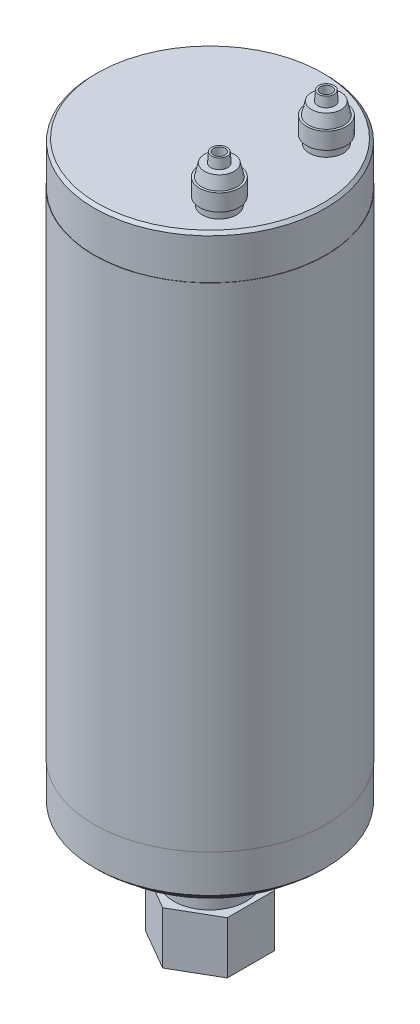
ISO-10303-21;
HEADER;
FILE_DESCRIPTION(('STEP AP214'),'2;1');
FILE_NAME('part.step','',(''),(''),'','','');
FILE_SCHEMA(('AUTOMOTIVE_DESIGN { 1 0 10303 214 1 1 1 1 }'));
ENDSEC;
DATA;
#1=APPLICATION_CONTEXT('core data for automotive mechanical design processes');
#2=APPLICATION_PROTOCOL_DEFINITION('international standard','automotive_design',2000,#1);
#3=PRODUCT_CONTEXT('',#1,'mechanical');
#4=PRODUCT('Part','Part','',(#3));
#5=PRODUCT_RELATED_PRODUCT_CATEGORY('part','',(#4));
#6=PRODUCT_DEFINITION_FORMATION('','',#4);
#7=PRODUCT_DEFINITION_CONTEXT('part definition',#1,'design');
#8=PRODUCT_DEFINITION('design','',#6,#7);
#9=PRODUCT_DEFINITION_SHAPE('','',#8);
#10=(LENGTH_UNIT() NAMED_UNIT(*) SI_UNIT(.MILLI.,.METRE.));
#11=(NAMED_UNIT(*) PLANE_ANGLE_UNIT() SI_UNIT($,.RADIAN.));
#12=(NAMED_UNIT(*) SI_UNIT($,.STERADIAN.) SOLID_ANGLE_UNIT());
#13=UNCERTAINTY_MEASURE_WITH_UNIT(LENGTH_MEASURE(1.E-05),#10,'distance_accuracy_value','');
#14=(GEOMETRIC_REPRESENTATION_CONTEXT(3) GLOBAL_UNCERTAINTY_ASSIGNED_CONTEXT((#13)) GLOBAL_UNIT_ASSIGNED_CONTEXT((#10,
#11,#12)) REPRESENTATION_CONTEXT('',''));
#15=CARTESIAN_POINT('',(0.,0.,0.));
#16=DIRECTION('',(0.,0.,1.));
#17=DIRECTION('',(1.,0.,0.));
#18=AXIS2_PLACEMENT_3D('',#15,#16,#17);
#19=CARTESIAN_POINT('',(0.,104.5,0.));
#20=DIRECTION('',(0.,1.,0.));
#21=DIRECTION('',(0.,0.,1.));
#22=AXIS2_PLACEMENT_3D('',#19,#20,#21);
#23=PLANE('',#22);
#24=CARTESIAN_POINT('',(21.67,104.5,18.45));
#25=DIRECTION('',(0.,1.,0.));
#26=DIRECTION('',(0.,0.,1.));
#27=AXIS2_PLACEMENT_3D('',#24,#25,#26);
#28=CIRCLE('',#27,5.85);
#29=CARTESIAN_POINT('',(21.67,104.5,24.3));
#30=VERTEX_POINT('',#29);
#31=EDGE_CURVE('E47',#30,#30,#28,.T.);
#32=ORIENTED_EDGE('',*,*,#31,.F.);
#33=EDGE_LOOP('',(#32));
#34=FACE_BOUND('',#33,.T.);
#35=CARTESIAN_POINT('',(21.67,104.5,-18.45));
#36=DIRECTION('',(0.,1.,0.));
#37=DIRECTION('',(0.,0.,1.));
#38=AXIS2_PLACEMENT_3D('',#35,#36,#37);
#39=CIRCLE('',#38,5.85);
#40=CARTESIAN_POINT('',(21.67,104.5,-12.6));
#41=VERTEX_POINT('',#40);
#42=EDGE_CURVE('E195',#41,#41,#39,.T.);
#43=ORIENTED_EDGE('',*,*,#42,.F.);
#44=EDGE_LOOP('',(#43));
#45=FACE_BOUND('',#44,.T.);
#46=CARTESIAN_POINT('',(0.,104.5,0.));
#47=DIRECTION('',(0.,1.,0.));
#48=DIRECTION('',(0.,0.,1.));
#49=AXIS2_PLACEMENT_3D('',#46,#47,#48);
#50=CIRCLE('',#49,38.9);
#51=CARTESIAN_POINT('',(0.,104.5,38.9));
#52=VERTEX_POINT('',#51);
#53=EDGE_CURVE('E171',#52,#52,#50,.T.);
#54=ORIENTED_EDGE('',*,*,#53,.T.);
#55=EDGE_LOOP('',(#54));
#56=FACE_BOUND('',#55,.T.);
#57=ADVANCED_FACE('F38',(#34,#45,#56),#23,.T.);
#58=CARTESIAN_POINT('',(0.,104.5,0.));
#59=DIRECTION('',(0.,1.,0.));
#60=DIRECTION('',(0.,0.,1.));
#61=AXIS2_PLACEMENT_3D('',#58,#59,#60);
#62=CYLINDRICAL_SURFACE('',#61,39.9);
#63=CARTESIAN_POINT('',(0.,103.5,0.));
#64=DIRECTION('',(0.,1.,0.));
#65=DIRECTION('',(0.,0.,1.));
#66=AXIS2_PLACEMENT_3D('',#63,#64,#65);
#67=CIRCLE('',#66,39.9);
#68=CARTESIAN_POINT('',(0.,103.5,39.9));
#69=VERTEX_POINT('',#68);
#70=EDGE_CURVE('E174',#69,#69,#67,.F.);
#71=ORIENTED_EDGE('',*,*,#70,.T.);
#72=EDGE_LOOP('',(#71));
#73=FACE_BOUND('',#72,.T.);
#74=CARTESIAN_POINT('',(0.,89.5,0.));
#75=DIRECTION('',(0.,1.,0.));
#76=DIRECTION('',(0.,0.,1.));
#77=AXIS2_PLACEMENT_3D('',#74,#75,#76);
#78=CIRCLE('',#77,39.9);
#79=CARTESIAN_POINT('',(0.,89.5,39.9));
#80=VERTEX_POINT('',#79);
#81=EDGE_CURVE('E168',#80,#80,#78,.T.);
#82=ORIENTED_EDGE('',*,*,#81,.T.);
#83=EDGE_LOOP('',(#82));
#84=FACE_BOUND('',#83,.T.);
#85=ADVANCED_FACE('F207',(#73,#84),#62,.T.);
#86=CARTESIAN_POINT('',(0.,89.5,39.9));
#87=DIRECTION('',(0.,1.,0.));
#88=DIRECTION('',(0.,0.,1.));
#89=AXIS2_PLACEMENT_3D('',#86,#87,#88);
#90=PLANE('',#89);
#91=CARTESIAN_POINT('',(0.,89.5,0.));
#92=DIRECTION('',(0.,1.,0.));
#93=DIRECTION('',(0.,0.,1.));
#94=AXIS2_PLACEMENT_3D('',#91,#92,#93);
#95=CIRCLE('',#94,40.);
#96=CARTESIAN_POINT('',(0.,89.5,40.));
#97=VERTEX_POINT('',#96);
#98=EDGE_CURVE('E165',#97,#97,#95,.T.);
#99=ORIENTED_EDGE('',*,*,#98,.T.);
#100=EDGE_LOOP('',(#99));
#101=FACE_BOUND('',#100,.T.);
#102=ORIENTED_EDGE('',*,*,#81,.F.);
#103=EDGE_LOOP('',(#102));
#104=FACE_BOUND('',#103,.T.);
#105=ADVANCED_FACE('F233',(#101,#104),#90,.T.);
#106=CARTESIAN_POINT('',(0.,104.5,0.));
#107=DIRECTION('',(0.,1.,0.));
#108=DIRECTION('',(0.,0.,1.));
#109=AXIS2_PLACEMENT_3D('',#106,#107,#108);
#110=CYLINDRICAL_SURFACE('',#109,40.);
#111=CARTESIAN_POINT('',(0.,-80.5,0.));
#112=DIRECTION('',(0.,1.,0.));
#113=DIRECTION('',(0.,0.,1.));
#114=AXIS2_PLACEMENT_3D('',#111,#112,#113);
#115=CIRCLE('',#114,40.);
#116=CARTESIAN_POINT('',(0.,-80.5,40.));
#117=VERTEX_POINT('',#116);
#118=EDGE_CURVE('E162',#117,#117,#115,.T.);
#119=ORIENTED_EDGE('',*,*,#118,.T.);
#120=EDGE_LOOP('',(#119));
#121=FACE_BOUND('',#120,.T.);
#122=ORIENTED_EDGE('',*,*,#98,.F.);
#123=EDGE_LOOP('',(#122));
#124=FACE_BOUND('',#123,.T.);
#125=ADVANCED_FACE('F237',(#121,#124),#110,.T.);
#126=CARTESIAN_POINT('',(0.,-80.5,40.));
#127=DIRECTION('',(0.,-1.,0.));
#128=DIRECTION('',(0.,0.,-1.));
#129=AXIS2_PLACEMENT_3D('',#126,#127,#128);
#130=PLANE('',#129);
#131=CARTESIAN_POINT('',(0.,-80.5,0.));
#132=DIRECTION('',(0.,1.,0.));
#133=DIRECTION('',(0.,0.,1.));
#134=AXIS2_PLACEMENT_3D('',#131,#132,#133);
#135=CIRCLE('',#134,39.9);
#136=CARTESIAN_POINT('',(0.,-80.5,39.9));
#137=VERTEX_POINT('',#136);
#138=EDGE_CURVE('E159',#137,#137,#135,.T.);
#139=ORIENTED_EDGE('',*,*,#138,.T.);
#140=EDGE_LOOP('',(#139));
#141=FACE_BOUND('',#140,.T.);
#142=ORIENTED_EDGE('',*,*,#118,.F.);
#143=EDGE_LOOP('',(#142));
#144=FACE_BOUND('',#143,.T.);
#145=ADVANCED_FACE('F241',(#141,#144),#130,.T.);
#146=CARTESIAN_POINT('',(0.,104.5,0.));
#147=DIRECTION('',(0.,1.,0.));
#148=DIRECTION('',(0.,0.,1.));
#149=AXIS2_PLACEMENT_3D('',#146,#147,#148);
#150=CYLINDRICAL_SURFACE('',#149,39.9);
#151=CARTESIAN_POINT('',(0.,-93.5,0.));
#152=DIRECTION('',(0.,-1.,0.));
#153=DIRECTION('',(0.,0.,-1.));
#154=AXIS2_PLACEMENT_3D('',#151,#152,#153);
#155=CIRCLE('',#154,39.9);
#156=CARTESIAN_POINT('',(0.,-93.5,-39.9));
#157=VERTEX_POINT('',#156);
#158=EDGE_CURVE('E177',#157,#157,#155,.F.);
#159=ORIENTED_EDGE('',*,*,#158,.T.);
#160=EDGE_LOOP('',(#159));
#161=FACE_BOUND('',#160,.T.);
#162=ORIENTED_EDGE('',*,*,#138,.F.);
#163=EDGE_LOOP('',(#162));
#164=FACE_BOUND('',#163,.T.);
#165=ADVANCED_FACE('F245',(#161,#164),#150,.T.);
#166=CARTESIAN_POINT('',(0.,-94.5,39.9));
#167=DIRECTION('',(0.,-1.,0.));
#168=DIRECTION('',(0.,0.,-1.));
#169=AXIS2_PLACEMENT_3D('',#166,#167,#168);
#170=PLANE('',#169);
#171=CARTESIAN_POINT('',(0.,-94.5,0.));
#172=DIRECTION('',(0.,-1.,0.));
#173=DIRECTION('',(0.,0.,-1.));
#174=AXIS2_PLACEMENT_3D('',#171,#172,#173);
#175=CIRCLE('',#174,38.9);
#176=CARTESIAN_POINT('',(0.,-94.5,-38.9));
#177=VERTEX_POINT('',#176);
#178=EDGE_CURVE('E180',#177,#177,#175,.T.);
#179=ORIENTED_EDGE('',*,*,#178,.T.);
#180=EDGE_LOOP('',(#179));
#181=FACE_BOUND('',#180,.T.);
#182=CARTESIAN_POINT('',(0.,-94.5,0.));
#183=DIRECTION('',(0.,1.,0.));
#184=DIRECTION('',(0.,0.,1.));
#185=AXIS2_PLACEMENT_3D('',#182,#183,#184);
#186=CIRCLE('',#185,35.);
#187=CARTESIAN_POINT('',(0.,-94.5,35.));
#188=VERTEX_POINT('',#187);
#189=EDGE_CURVE('E156',#188,#188,#186,.T.);
#190=ORIENTED_EDGE('',*,*,#189,.T.);
#191=EDGE_LOOP('',(#190));
#192=FACE_BOUND('',#191,.T.);
#193=ADVANCED_FACE('F249',(#181,#192),#170,.T.);
#194=CARTESIAN_POINT('',(0.,104.5,0.));
#195=DIRECTION('',(0.,1.,0.));
#196=DIRECTION('',(0.,0.,1.));
#197=AXIS2_PLACEMENT_3D('',#194,#195,#196);
#198=CYLINDRICAL_SURFACE('',#197,35.);
#199=CARTESIAN_POINT('',(0.,-97.5,0.));
#200=DIRECTION('',(0.,-1.,0.));
#201=DIRECTION('',(0.,0.,-1.));
#202=AXIS2_PLACEMENT_3D('',#199,#200,#201);
#203=CIRCLE('',#202,35.);
#204=CARTESIAN_POINT('',(0.,-97.5,-35.));
#205=VERTEX_POINT('',#204);
#206=EDGE_CURVE('E183',#205,#205,#203,.F.);
#207=ORIENTED_EDGE('',*,*,#206,.T.);
#208=EDGE_LOOP('',(#207));
#209=FACE_BOUND('',#208,.T.);
#210=ORIENTED_EDGE('',*,*,#189,.F.);
#211=EDGE_LOOP('',(#210));
#212=FACE_BOUND('',#211,.T.);
#213=ADVANCED_FACE('F253',(#209,#212),#198,.T.);
#214=CARTESIAN_POINT('',(0.,-98.5,35.));
#215=DIRECTION('',(0.,-1.,0.));
#216=DIRECTION('',(0.,0.,-1.));
#217=AXIS2_PLACEMENT_3D('',#214,#215,#216);
#218=PLANE('',#217);
#219=CARTESIAN_POINT('',(0.,-98.5,0.));
#220=DIRECTION('',(0.,-1.,0.));
#221=DIRECTION('',(0.,0.,-1.));
#222=AXIS2_PLACEMENT_3D('',#219,#220,#221);
#223=CIRCLE('',#222,34.0000000000001);
#224=CARTESIAN_POINT('',(0.,-98.5,-34.0000000000001));
#225=VERTEX_POINT('',#224);
#226=EDGE_CURVE('E186',#225,#225,#223,.T.);
#227=ORIENTED_EDGE('',*,*,#226,.T.);
#228=EDGE_LOOP('',(#227));
#229=FACE_BOUND('',#228,.T.);
#230=CARTESIAN_POINT('',(0.,-98.5,0.));
#231=DIRECTION('',(0.,1.,0.));
#232=DIRECTION('',(0.,0.,1.));
#233=AXIS2_PLACEMENT_3D('',#230,#231,#232);
#234=CIRCLE('',#233,21.965);
#235=CARTESIAN_POINT('',(0.,-98.5,21.965));
#236=VERTEX_POINT('',#235);
#237=EDGE_CURVE('E153',#236,#236,#234,.T.);
#238=ORIENTED_EDGE('',*,*,#237,.T.);
#239=EDGE_LOOP('',(#238));
#240=FACE_BOUND('',#239,.T.);
#241=ADVANCED_FACE('F257',(#229,#240),#218,.T.);
#242=CARTESIAN_POINT('',(0.,-98.5,0.));
#243=DIRECTION('',(0.,1.,0.));
#244=DIRECTION('',(0.,0.,1.));
#245=AXIS2_PLACEMENT_3D('',#242,#243,#244);
#246=CONICAL_SURFACE('',#245,21.965,0.327738506780555);
#247=CARTESIAN_POINT('',(0.,-104.5,0.));
#248=DIRECTION('',(0.,1.,0.));
#249=DIRECTION('',(0.,0.,1.));
#250=AXIS2_PLACEMENT_3D('',#247,#248,#249);
#251=CIRCLE('',#250,19.925);
#252=CARTESIAN_POINT('',(0.,-104.5,19.925));
#253=VERTEX_POINT('',#252);
#254=EDGE_CURVE('E148',#253,#253,#251,.T.);
#255=ORIENTED_EDGE('',*,*,#254,.T.);
#256=EDGE_LOOP('',(#255));
#257=FACE_BOUND('',#256,.T.);
#258=ORIENTED_EDGE('',*,*,#237,.F.);
#259=EDGE_LOOP('',(#258));
#260=FACE_BOUND('',#259,.T.);
#261=ADVANCED_FACE('F261',(#257,#260),#246,.T.);
#262=CARTESIAN_POINT('',(0.,-104.5,19.925));
#263=DIRECTION('',(0.,-1.,0.));
#264=DIRECTION('',(0.,0.,-1.));
#265=AXIS2_PLACEMENT_3D('',#262,#263,#264);
#266=PLANE('',#265);
#267=CARTESIAN_POINT('',(0.,-104.5,0.));
#268=DIRECTION('',(0.,-1.,0.));
#269=DIRECTION('',(0.,0.,-1.));
#270=AXIS2_PLACEMENT_3D('',#267,#268,#269);
#271=CIRCLE('',#270,12.5);
#272=CARTESIAN_POINT('',(0.,-104.5,12.5));
#273=VERTEX_POINT('',#272);
#274=EDGE_CURVE('E144',#273,#273,#271,.T.);
#275=ORIENTED_EDGE('',*,*,#274,.F.);
#276=EDGE_LOOP('',(#275));
#277=FACE_BOUND('',#276,.T.);
#278=ORIENTED_EDGE('',*,*,#254,.F.);
#279=EDGE_LOOP('',(#278));
#280=FACE_BOUND('',#279,.T.);
#281=ADVANCED_FACE('F226',(#277,#280),#266,.T.);
#282=CARTESIAN_POINT('',(0.,-117.22,0.));
#283=DIRECTION('',(0.,1.,0.));
#284=DIRECTION('',(0.,0.,1.));
#285=AXIS2_PLACEMENT_3D('',#282,#283,#284);
#286=CYLINDRICAL_SURFACE('',#285,12.5);
#287=CARTESIAN_POINT('',(0.,-117.22,0.));
#288=DIRECTION('',(0.,-1.,0.));
#289=DIRECTION('',(0.,0.,-1.));
#290=AXIS2_PLACEMENT_3D('',#287,#288,#289);
#291=CIRCLE('',#290,12.5);
#292=CARTESIAN_POINT('',(0.,-117.22,12.5));
#293=VERTEX_POINT('',#292);
#294=EDGE_CURVE('E145',#293,#293,#291,.T.);
#295=CARTESIAN_POINT('',(0.,-117.22,12.5));
#296=CARTESIAN_POINT('',(0.,-117.0875,12.5));
#297=CARTESIAN_POINT('',(0.,-116.955,12.5));
#298=CARTESIAN_POINT('',(0.,-116.69,12.5));
#299=CARTESIAN_POINT('',(0.,-116.5575,12.5));
#300=CARTESIAN_POINT('',(0.,-116.2925,12.5));
#301=CARTESIAN_POINT('',(0.,-116.16,12.5));
#302=CARTESIAN_POINT('',(0.,-115.895,12.5));
#303=CARTESIAN_POINT('',(0.,-115.7625,12.5));
#304=CARTESIAN_POINT('',(0.,-115.4975,12.5));
#305=CARTESIAN_POINT('',(0.,-115.365,12.5));
#306=CARTESIAN_POINT('',(0.,-115.1,12.5));
#307=CARTESIAN_POINT('',(0.,-114.9675,12.5));
#308=CARTESIAN_POINT('',(0.,-114.7025,12.5));
#309=CARTESIAN_POINT('',(0.,-114.57,12.5));
#310=CARTESIAN_POINT('',(0.,-114.305,12.5));
#311=CARTESIAN_POINT('',(0.,-114.1725,12.5));
#312=CARTESIAN_POINT('',(0.,-113.9075,12.5));
#313=CARTESIAN_POINT('',(0.,-113.775,12.5));
#314=CARTESIAN_POINT('',(0.,-113.51,12.5));
#315=CARTESIAN_POINT('',(0.,-113.3775,12.5));
#316=CARTESIAN_POINT('',(0.,-113.1125,12.5));
#317=CARTESIAN_POINT('',(0.,-112.98,12.5));
#318=CARTESIAN_POINT('',(0.,-112.715,12.5));
#319=CARTESIAN_POINT('',(0.,-112.5825,12.5));
#320=CARTESIAN_POINT('',(0.,-112.3175,12.5));
#321=CARTESIAN_POINT('',(0.,-112.185,12.5));
#322=CARTESIAN_POINT('',(0.,-111.92,12.5));
#323=CARTESIAN_POINT('',(0.,-111.7875,12.5));
#324=CARTESIAN_POINT('',(0.,-111.5225,12.5));
#325=CARTESIAN_POINT('',(0.,-111.39,12.5));
#326=CARTESIAN_POINT('',(0.,-111.125,12.5));
#327=CARTESIAN_POINT('',(0.,-110.9925,12.5));
#328=CARTESIAN_POINT('',(0.,-110.7275,12.5));
#329=CARTESIAN_POINT('',(0.,-110.595,12.5));
#330=CARTESIAN_POINT('',(0.,-110.33,12.5));
#331=CARTESIAN_POINT('',(0.,-110.1975,12.5));
#332=CARTESIAN_POINT('',(0.,-109.9325,12.5));
#333=CARTESIAN_POINT('',(0.,-109.8,12.5));
#334=CARTESIAN_POINT('',(0.,-109.535,12.5));
#335=CARTESIAN_POINT('',(0.,-109.4025,12.5));
#336=CARTESIAN_POINT('',(0.,-109.1375,12.5));
#337=CARTESIAN_POINT('',(0.,-109.005,12.5));
#338=CARTESIAN_POINT('',(0.,-108.74,12.5));
#339=CARTESIAN_POINT('',(0.,-108.6075,12.5));
#340=CARTESIAN_POINT('',(0.,-108.3425,12.5));
#341=CARTESIAN_POINT('',(0.,-108.21,12.5));
#342=CARTESIAN_POINT('',(0.,-107.945,12.5));
#343=CARTESIAN_POINT('',(0.,-107.8125,12.5));
#344=CARTESIAN_POINT('',(0.,-107.5475,12.5));
#345=CARTESIAN_POINT('',(0.,-107.415,12.5));
#346=CARTESIAN_POINT('',(0.,-107.15,12.5));
#347=CARTESIAN_POINT('',(0.,-107.0175,12.5));
#348=CARTESIAN_POINT('',(0.,-106.7525,12.5));
#349=CARTESIAN_POINT('',(0.,-106.62,12.5));
#350=CARTESIAN_POINT('',(0.,-106.355,12.5));
#351=CARTESIAN_POINT('',(0.,-106.2225,12.5));
#352=CARTESIAN_POINT('',(0.,-105.9575,12.5));
#353=CARTESIAN_POINT('',(0.,-105.825,12.5));
#354=CARTESIAN_POINT('',(0.,-105.56,12.5));
#355=CARTESIAN_POINT('',(0.,-105.4275,12.5));
#356=CARTESIAN_POINT('',(0.,-105.1625,12.5));
#357=CARTESIAN_POINT('',(0.,-105.03,12.5));
#358=CARTESIAN_POINT('',(0.,-104.765,12.5));
#359=CARTESIAN_POINT('',(0.,-104.6325,12.5));
#360=CARTESIAN_POINT('',(0.,-104.5,12.5));
#361=B_SPLINE_CURVE_WITH_KNOTS('',3,(#295,#296,#297,#298,#299,#300,#301,#302,#303,#304,#305,
#306,#307,#308,#309,#310,#311,#312,#313,#314,#315,#316,#317,#318,#319,#320,#321,#322,#323,#324,
#325,#326,#327,#328,#329,#330,#331,#332,#333,#334,#335,#336,#337,#338,#339,#340,#341,#342,#343,
#344,#345,#346,#347,#348,#349,#350,#351,#352,#353,#354,#355,#356,#357,#358,#359,#360),
.UNSPECIFIED.,.F.,.F.,(4,2,2,2,2,2,2,2,2,2,2,2,2,2,2,2,2,2,2,2,2,2,2,2,2,2,2,2,2,2,2,2,4),(0.,
0.397499999999995,0.79499999999999,1.1925,1.58999999999999,1.98749999999999,2.385,
2.78249999999999,3.17999999999999,3.5775,3.97499999999999,4.37249999999999,4.77,
5.16749999999999,5.56499999999999,5.9625,6.35999999999999,6.75749999999999,7.15499999999999,
7.55249999999999,7.94999999999999,8.34749999999999,8.74499999999999,9.1425,9.53999999999999,
9.93749999999999,10.335,10.7325,11.13,11.5275,11.925,12.3225,12.72),.UNSPECIFIED.);
#362=EDGE_CURVE('BSEAM218',#293,#273,#361,.T.);
#363=ORIENTED_EDGE('',*,*,#294,.F.);
#364=ORIENTED_EDGE('',*,*,#274,.T.);
#365=ORIENTED_EDGE('',*,*,#362,.T.);
#366=ORIENTED_EDGE('',*,*,#362,.F.);
#367=EDGE_LOOP('',(#363,#365,#364,#366));
#368=FACE_BOUND('',#367,.T.);
#369=ADVANCED_FACE('F218',(#368),#286,.T.);
#370=CARTESIAN_POINT('',(0.,104.5,0.));
#371=DIRECTION('',(0.,-1.,0.));
#372=DIRECTION('',(0.,0.,-1.));
#373=AXIS2_PLACEMENT_3D('',#370,#371,#372);
#374=CONICAL_SURFACE('',#373,38.9,0.785398163397452);
#375=ORIENTED_EDGE('',*,*,#70,.F.);
#376=EDGE_LOOP('',(#375));
#377=FACE_BOUND('',#376,.T.);
#378=ORIENTED_EDGE('',*,*,#53,.F.);
#379=EDGE_LOOP('',(#378));
#380=FACE_BOUND('',#379,.T.);
#381=ADVANCED_FACE('F215',(#377,#380),#374,.T.);
#382=CARTESIAN_POINT('',(0.,-93.5,0.));
#383=DIRECTION('',(0.,1.,0.));
#384=DIRECTION('',(0.,0.,1.));
#385=AXIS2_PLACEMENT_3D('',#382,#383,#384);
#386=CONICAL_SURFACE('',#385,39.9,0.785398163397441);
#387=ORIENTED_EDGE('',*,*,#178,.F.);
#388=EDGE_LOOP('',(#387));
#389=FACE_BOUND('',#388,.T.);
#390=ORIENTED_EDGE('',*,*,#158,.F.);
#391=EDGE_LOOP('',(#390));
#392=FACE_BOUND('',#391,.T.);
#393=ADVANCED_FACE('F217',(#389,#392),#386,.T.);
#394=CARTESIAN_POINT('',(0.,-97.5,0.));
#395=DIRECTION('',(0.,1.,0.));
#396=DIRECTION('',(0.,0.,1.));
#397=AXIS2_PLACEMENT_3D('',#394,#395,#396);
#398=CONICAL_SURFACE('',#397,35.,0.785398163397441);
#399=ORIENTED_EDGE('',*,*,#226,.F.);
#400=EDGE_LOOP('',(#399));
#401=FACE_BOUND('',#400,.T.);
#402=ORIENTED_EDGE('',*,*,#206,.F.);
#403=EDGE_LOOP('',(#402));
#404=FACE_BOUND('',#403,.T.);
#405=ADVANCED_FACE('F40',(#401,#404),#398,.T.);
#406=CARTESIAN_POINT('',(14.125,-135.22,8.15507255230347));
#407=DIRECTION('',(-0.5,0.,-0.866025403784439));
#408=DIRECTION('',(-0.866025403784439,0.,0.5));
#409=AXIS2_PLACEMENT_3D('',#406,#407,#408);
#410=PLANE('',#409);
#411=DIRECTION('',(-0.866025403784439,0.,0.5));
#412=VECTOR('',#411,1.);
#413=CARTESIAN_POINT('',(14.125,-117.22,8.15507255230347));
#414=LINE('',#413,#412);
#415=CARTESIAN_POINT('',(14.125,-117.22,8.15507255230347));
#416=VERTEX_POINT('',#415);
#417=CARTESIAN_POINT('',(0.,-117.22,16.3101451046069));
#418=VERTEX_POINT('',#417);
#419=EDGE_CURVE('E124',#416,#418,#414,.T.);
#420=ORIENTED_EDGE('',*,*,#419,.T.);
#421=DIRECTION('',(0.,1.,0.));
#422=VECTOR('',#421,1.);
#423=CARTESIAN_POINT('',(0.,-135.22,16.3101451046069));
#424=LINE('',#423,#422);
#425=CARTESIAN_POINT('',(0.,-135.22,16.3101451046069));
#426=VERTEX_POINT('',#425);
#427=EDGE_CURVE('E142',#426,#418,#424,.T.);
#428=ORIENTED_EDGE('',*,*,#427,.F.);
#429=DIRECTION('',(-0.866025403784439,0.,0.5));
#430=VECTOR('',#429,1.);
#431=CARTESIAN_POINT('',(14.125,-135.22,8.15507255230347));
#432=LINE('',#431,#430);
#433=CARTESIAN_POINT('',(14.125,-135.22,8.15507255230347));
#434=VERTEX_POINT('',#433);
#435=EDGE_CURVE('E135',#434,#426,#432,.T.);
#436=ORIENTED_EDGE('',*,*,#435,.F.);
#437=DIRECTION('',(0.,1.,0.));
#438=VECTOR('',#437,1.);
#439=CARTESIAN_POINT('',(14.125,-135.22,8.15507255230347));
#440=LINE('',#439,#438);
#441=EDGE_CURVE('E120',#434,#416,#440,.T.);
#442=ORIENTED_EDGE('',*,*,#441,.T.);
#443=EDGE_LOOP('',(#420,#428,#436,#442));
#444=FACE_BOUND('',#443,.T.);
#445=ADVANCED_FACE('F269',(#444),#410,.F.);
#446=CARTESIAN_POINT('',(0.,-135.22,16.3101451046069));
#447=DIRECTION('',(0.5,0.,-0.866025403784438));
#448=DIRECTION('',(-0.866025403784438,0.,-0.5));
#449=AXIS2_PLACEMENT_3D('',#446,#447,#448);
#450=PLANE('',#449);
#451=DIRECTION('',(-0.866025403784438,0.,-0.5));
#452=VECTOR('',#451,1.);
#453=CARTESIAN_POINT('',(0.,-117.22,16.3101451046069));
#454=LINE('',#453,#452);
#455=CARTESIAN_POINT('',(-14.125,-117.22,8.15507255230346));
#456=VERTEX_POINT('',#455);
#457=EDGE_CURVE('E127',#418,#456,#454,.T.);
#458=ORIENTED_EDGE('',*,*,#457,.T.);
#459=DIRECTION('',(0.,1.,0.));
#460=VECTOR('',#459,1.);
#461=CARTESIAN_POINT('',(-14.125,-135.22,8.15507255230346));
#462=LINE('',#461,#460);
#463=CARTESIAN_POINT('',(-14.125,-135.22,8.15507255230346));
#464=VERTEX_POINT('',#463);
#465=EDGE_CURVE('E139',#464,#456,#462,.T.);
#466=ORIENTED_EDGE('',*,*,#465,.F.);
#467=DIRECTION('',(-0.866025403784438,0.,-0.5));
#468=VECTOR('',#467,1.);
#469=CARTESIAN_POINT('',(0.,-135.22,16.3101451046069));
#470=LINE('',#469,#468);
#471=EDGE_CURVE('E93',#426,#464,#470,.T.);
#472=ORIENTED_EDGE('',*,*,#471,.F.);
#473=ORIENTED_EDGE('',*,*,#427,.T.);
#474=EDGE_LOOP('',(#458,#466,#472,#473));
#475=FACE_BOUND('',#474,.T.);
#476=ADVANCED_FACE('F272',(#475),#450,.F.);
#477=CARTESIAN_POINT('',(-14.125,-135.22,8.15507255230346));
#478=DIRECTION('',(1.,0.,0.));
#479=DIRECTION('',(0.,0.,-1.));
#480=AXIS2_PLACEMENT_3D('',#477,#478,#479);
#481=PLANE('',#480);
#482=DIRECTION('',(0.,0.,-1.));
#483=VECTOR('',#482,1.);
#484=CARTESIAN_POINT('',(-14.125,-117.22,8.15507255230346));
#485=LINE('',#484,#483);
#486=CARTESIAN_POINT('',(-14.125,-117.22,-8.15507255230346));
#487=VERTEX_POINT('',#486);
#488=EDGE_CURVE('E130',#456,#487,#485,.T.);
#489=ORIENTED_EDGE('',*,*,#488,.T.);
#490=DIRECTION('',(0.,1.,0.));
#491=VECTOR('',#490,1.);
#492=CARTESIAN_POINT('',(-14.125,-135.22,-8.15507255230346));
#493=LINE('',#492,#491);
#494=CARTESIAN_POINT('',(-14.125,-135.22,-8.15507255230346));
#495=VERTEX_POINT('',#494);
#496=EDGE_CURVE('E115',#495,#487,#493,.T.);
#497=ORIENTED_EDGE('',*,*,#496,.F.);
#498=DIRECTION('',(0.,0.,-1.));
#499=VECTOR('',#498,1.);
#500=CARTESIAN_POINT('',(-14.125,-135.22,8.15507255230346));
#501=LINE('',#500,#499);
#502=EDGE_CURVE('E106',#464,#495,#501,.T.);
#503=ORIENTED_EDGE('',*,*,#502,.F.);
#504=ORIENTED_EDGE('',*,*,#465,.T.);
#505=EDGE_LOOP('',(#489,#497,#503,#504));
#506=FACE_BOUND('',#505,.T.);
#507=ADVANCED_FACE('F276',(#506),#481,.F.);
#508=CARTESIAN_POINT('',(-14.125,-135.22,-8.15507255230346));
#509=DIRECTION('',(0.5,0.,0.866025403784439));
#510=DIRECTION('',(0.866025403784439,0.,-0.5));
#511=AXIS2_PLACEMENT_3D('',#508,#509,#510);
#512=PLANE('',#511);
#513=DIRECTION('',(0.866025403784439,0.,-0.5));
#514=VECTOR('',#513,1.);
#515=CARTESIAN_POINT('',(-14.125,-117.22,-8.15507255230346));
#516=LINE('',#515,#514);
#517=CARTESIAN_POINT('',(0.,-117.22,-16.3101451046069));
#518=VERTEX_POINT('',#517);
#519=EDGE_CURVE('E114',#487,#518,#516,.T.);
#520=ORIENTED_EDGE('',*,*,#519,.T.);
#521=DIRECTION('',(0.,1.,0.));
#522=VECTOR('',#521,1.);
#523=CARTESIAN_POINT('',(0.,-135.22,-16.3101451046069));
#524=LINE('',#523,#522);
#525=CARTESIAN_POINT('',(0.,-135.22,-16.3101451046069));
#526=VERTEX_POINT('',#525);
#527=EDGE_CURVE('E111',#526,#518,#524,.T.);
#528=ORIENTED_EDGE('',*,*,#527,.F.);
#529=DIRECTION('',(0.866025403784439,0.,-0.5));
#530=VECTOR('',#529,1.);
#531=CARTESIAN_POINT('',(-14.125,-135.22,-8.15507255230346));
#532=LINE('',#531,#530);
#533=EDGE_CURVE('E100',#495,#526,#532,.T.);
#534=ORIENTED_EDGE('',*,*,#533,.F.);
#535=ORIENTED_EDGE('',*,*,#496,.T.);
#536=EDGE_LOOP('',(#520,#528,#534,#535));
#537=FACE_BOUND('',#536,.T.);
#538=ADVANCED_FACE('F112',(#537),#512,.F.);
#539=CARTESIAN_POINT('',(0.,-135.22,-16.3101451046069));
#540=DIRECTION('',(-0.5,0.,0.866025403784439));
#541=DIRECTION('',(0.866025403784439,0.,0.5));
#542=AXIS2_PLACEMENT_3D('',#539,#540,#541);
#543=PLANE('',#542);
#544=DIRECTION('',(0.866025403784439,0.,0.5));
#545=VECTOR('',#544,1.);
#546=CARTESIAN_POINT('',(0.,-117.22,-16.3101451046069));
#547=LINE('',#546,#545);
#548=CARTESIAN_POINT('',(14.125,-117.22,-8.15507255230346));
#549=VERTEX_POINT('',#548);
#550=EDGE_CURVE('E78',#518,#549,#547,.T.);
#551=ORIENTED_EDGE('',*,*,#550,.T.);
#552=DIRECTION('',(0.,1.,0.));
#553=VECTOR('',#552,1.);
#554=CARTESIAN_POINT('',(14.125,-135.22,-8.15507255230346));
#555=LINE('',#554,#553);
#556=CARTESIAN_POINT('',(14.125,-135.22,-8.15507255230346));
#557=VERTEX_POINT('',#556);
#558=EDGE_CURVE('E116',#557,#549,#555,.T.);
#559=ORIENTED_EDGE('',*,*,#558,.F.);
#560=DIRECTION('',(0.866025403784439,0.,0.5));
#561=VECTOR('',#560,1.);
#562=CARTESIAN_POINT('',(0.,-135.22,-16.3101451046069));
#563=LINE('',#562,#561);
#564=EDGE_CURVE('E104',#526,#557,#563,.T.);
#565=ORIENTED_EDGE('',*,*,#564,.F.);
#566=ORIENTED_EDGE('',*,*,#527,.T.);
#567=EDGE_LOOP('',(#551,#559,#565,#566));
#568=FACE_BOUND('',#567,.T.);
#569=ADVANCED_FACE('F118',(#568),#543,.F.);
#570=CARTESIAN_POINT('',(14.125,-135.22,-8.15507255230346));
#571=DIRECTION('',(-1.,0.,0.));
#572=DIRECTION('',(0.,0.,1.));
#573=AXIS2_PLACEMENT_3D('',#570,#571,#572);
#574=PLANE('',#573);
#575=DIRECTION('',(0.,0.,1.));
#576=VECTOR('',#575,1.);
#577=CARTESIAN_POINT('',(14.125,-117.22,-8.15507255230346));
#578=LINE('',#577,#576);
#579=EDGE_CURVE('E84',#549,#416,#578,.T.);
#580=ORIENTED_EDGE('',*,*,#579,.T.);
#581=ORIENTED_EDGE('',*,*,#441,.F.);
#582=DIRECTION('',(0.,0.,1.));
#583=VECTOR('',#582,1.);
#584=CARTESIAN_POINT('',(14.125,-135.22,-8.15507255230346));
#585=LINE('',#584,#583);
#586=EDGE_CURVE('E55',#557,#434,#585,.T.);
#587=ORIENTED_EDGE('',*,*,#586,.F.);
#588=ORIENTED_EDGE('',*,*,#558,.T.);
#589=EDGE_LOOP('',(#580,#581,#587,#588));
#590=FACE_BOUND('',#589,.T.);
#591=ADVANCED_FACE('F284',(#590),#574,.F.);
#592=CARTESIAN_POINT('',(0.,-135.22,0.));
#593=DIRECTION('',(0.,-1.,0.));
#594=DIRECTION('',(0.,0.,-1.));
#595=AXIS2_PLACEMENT_3D('',#592,#593,#594);
#596=PLANE('',#595);
#597=CARTESIAN_POINT('',(0.,-135.22,0.));
#598=DIRECTION('',(0.,-1.,0.));
#599=DIRECTION('',(0.,0.,-1.));
#600=AXIS2_PLACEMENT_3D('',#597,#598,#599);
#601=CIRCLE('',#600,12.);
#602=CARTESIAN_POINT('',(0.,-135.22,-12.));
#603=VERTEX_POINT('',#602);
#604=EDGE_CURVE('E189',#603,#603,#601,.T.);
#605=ORIENTED_EDGE('',*,*,#604,.F.);
#606=EDGE_LOOP('',(#605));
#607=FACE_BOUND('',#606,.T.);
#608=ORIENTED_EDGE('',*,*,#435,.T.);
#609=ORIENTED_EDGE('',*,*,#471,.T.);
#610=ORIENTED_EDGE('',*,*,#502,.T.);
#611=ORIENTED_EDGE('',*,*,#533,.T.);
#612=ORIENTED_EDGE('',*,*,#564,.T.);
#613=ORIENTED_EDGE('',*,*,#586,.T.);
#614=EDGE_LOOP('',(#608,#609,#610,#611,#612,#613));
#615=FACE_BOUND('',#614,.T.);
#616=ADVANCED_FACE('F102',(#607,#615),#596,.T.);
#617=CARTESIAN_POINT('',(0.,-117.22,0.));
#618=DIRECTION('',(0.,-1.,0.));
#619=DIRECTION('',(0.,0.,-1.));
#620=AXIS2_PLACEMENT_3D('',#617,#618,#619);
#621=PLANE('',#620);
#622=ORIENTED_EDGE('',*,*,#294,.T.);
#623=EDGE_LOOP('',(#622));
#624=FACE_BOUND('',#623,.T.);
#625=ORIENTED_EDGE('',*,*,#419,.F.);
#626=ORIENTED_EDGE('',*,*,#579,.F.);
#627=ORIENTED_EDGE('',*,*,#550,.F.);
#628=ORIENTED_EDGE('',*,*,#519,.F.);
#629=ORIENTED_EDGE('',*,*,#488,.F.);
#630=ORIENTED_EDGE('',*,*,#457,.F.);
#631=EDGE_LOOP('',(#625,#626,#627,#628,#629,#630));
#632=FACE_BOUND('',#631,.T.);
#633=ADVANCED_FACE('F287',(#624,#632),#621,.F.);
#634=CARTESIAN_POINT('',(0.,258.155027854458,0.));
#635=DIRECTION('',(0.,1.,0.));
#636=DIRECTION('',(0.,0.,1.));
#637=AXIS2_PLACEMENT_3D('',#634,#635,#636);
#638=CYLINDRICAL_SURFACE('',#637,5.99999999999999);
#639=CARTESIAN_POINT('',(0.,-135.22,0.));
#640=DIRECTION('',(0.,-1.,0.));
#641=DIRECTION('',(0.,0.,-1.));
#642=AXIS2_PLACEMENT_3D('',#639,#640,#641);
#643=CIRCLE('',#642,5.99999999999999);
#644=CARTESIAN_POINT('',(0.,-135.22,-6.00000000000002));
#645=VERTEX_POINT('',#644);
#646=EDGE_CURVE('E192',#645,#645,#643,.F.);
#647=ORIENTED_EDGE('',*,*,#646,.T.);
#648=EDGE_LOOP('',(#647));
#649=FACE_BOUND('',#648,.T.);
#650=CARTESIAN_POINT('',(0.,-139.22,0.));
#651=DIRECTION('',(0.,1.,0.));
#652=DIRECTION('',(0.,0.,1.));
#653=AXIS2_PLACEMENT_3D('',#650,#651,#652);
#654=CIRCLE('',#653,5.99999999999999);
#655=CARTESIAN_POINT('',(0.,-139.22,5.99999999999995));
#656=VERTEX_POINT('',#655);
#657=EDGE_CURVE('E128',#656,#656,#654,.T.);
#658=ORIENTED_EDGE('',*,*,#657,.F.);
#659=EDGE_LOOP('',(#658));
#660=FACE_BOUND('',#659,.T.);
#661=ADVANCED_FACE('F290',(#649,#660),#638,.F.);
#662=CARTESIAN_POINT('',(0.,-139.22,5.99999999999995));
#663=DIRECTION('',(0.,-1.,0.));
#664=DIRECTION('',(0.,0.,-1.));
#665=AXIS2_PLACEMENT_3D('',#662,#663,#664);
#666=PLANE('',#665);
#667=ORIENTED_EDGE('',*,*,#657,.T.);
#668=EDGE_LOOP('',(#667));
#669=FACE_BOUND('',#668,.T.);
#670=CARTESIAN_POINT('',(0.,-139.22,0.));
#671=DIRECTION('',(0.,1.,0.));
#672=DIRECTION('',(0.,0.,1.));
#673=AXIS2_PLACEMENT_3D('',#670,#671,#672);
#674=CIRCLE('',#673,7.99999999999999);
#675=CARTESIAN_POINT('',(0.,-139.22,7.99999999999995));
#676=VERTEX_POINT('',#675);
#677=EDGE_CURVE('E433',#676,#676,#674,.T.);
#678=ORIENTED_EDGE('',*,*,#677,.F.);
#679=EDGE_LOOP('',(#678));
#680=FACE_BOUND('',#679,.T.);
#681=ADVANCED_FACE('F298',(#669,#680),#666,.T.);
#682=CARTESIAN_POINT('',(0.,-135.22,0.));
#683=DIRECTION('',(0.,1.,0.));
#684=DIRECTION('',(0.,0.,1.));
#685=AXIS2_PLACEMENT_3D('',#682,#683,#684);
#686=CONICAL_SURFACE('',#685,12.,0.785398163397448);
#687=ORIENTED_EDGE('',*,*,#677,.T.);
#688=EDGE_LOOP('',(#687));
#689=FACE_BOUND('',#688,.T.);
#690=ORIENTED_EDGE('',*,*,#604,.T.);
#691=EDGE_LOOP('',(#690));
#692=FACE_BOUND('',#691,.T.);
#693=ADVANCED_FACE('F302',(#689,#692),#686,.T.);
#694=ORIENTED_EDGE('',*,*,#646,.F.);
#695=EDGE_LOOP('',(#694));
#696=FACE_BOUND('',#695,.T.);
#697=ADVANCED_FACE('F295',(#696),#596,.T.);
#698=CARTESIAN_POINT('',(21.67,113.02,-25.275));
#699=DIRECTION('',(0.,1.,0.));
#700=DIRECTION('',(0.,0.,1.));
#701=AXIS2_PLACEMENT_3D('',#698,#699,#700);
#702=PLANE('',#701);
#703=CARTESIAN_POINT('',(21.67,113.02,-18.45));
#704=DIRECTION('',(0.,-1.,0.));
#705=DIRECTION('',(0.,0.,-1.));
#706=AXIS2_PLACEMENT_3D('',#703,#704,#705);
#707=CIRCLE('',#706,6.09);
#708=CARTESIAN_POINT('',(21.67,113.02,-24.54));
#709=VERTEX_POINT('',#708);
#710=EDGE_CURVE('E430',#709,#709,#707,.T.);
#711=ORIENTED_EDGE('',*,*,#710,.T.);
#712=EDGE_LOOP('',(#711));
#713=FACE_BOUND('',#712,.T.);
#714=CARTESIAN_POINT('',(21.67,113.02,-18.45));
#715=DIRECTION('',(0.,-1.,0.));
#716=DIRECTION('',(0.,0.,-1.));
#717=AXIS2_PLACEMENT_3D('',#714,#715,#716);
#718=CIRCLE('',#717,6.825);
#719=CARTESIAN_POINT('',(21.67,113.02,-25.275));
#720=VERTEX_POINT('',#719);
#721=EDGE_CURVE('E409',#720,#720,#718,.T.);
#722=ORIENTED_EDGE('',*,*,#721,.F.);
#723=EDGE_LOOP('',(#722));
#724=FACE_BOUND('',#723,.T.);
#725=ADVANCED_FACE('F307',(#713,#724),#702,.T.);
#726=CARTESIAN_POINT('',(21.67,113.02,-18.45));
#727=DIRECTION('',(0.,-1.,0.));
#728=DIRECTION('',(0.,0.,-1.));
#729=AXIS2_PLACEMENT_3D('',#726,#727,#728);
#730=CONICAL_SURFACE('',#729,6.09,0.23082332326429);
#731=CARTESIAN_POINT('',(21.67,117.19,-18.45));
#732=DIRECTION('',(0.,-1.,0.));
#733=DIRECTION('',(0.,0.,-1.));
#734=AXIS2_PLACEMENT_3D('',#731,#732,#733);
#735=CIRCLE('',#734,5.11);
#736=CARTESIAN_POINT('',(21.67,117.19,-23.56));
#737=VERTEX_POINT('',#736);
#738=EDGE_CURVE('E427',#737,#737,#735,.T.);
#739=ORIENTED_EDGE('',*,*,#738,.T.);
#740=EDGE_LOOP('',(#739));
#741=FACE_BOUND('',#740,.T.);
#742=ORIENTED_EDGE('',*,*,#710,.F.);
#743=EDGE_LOOP('',(#742));
#744=FACE_BOUND('',#743,.T.);
#745=ADVANCED_FACE('F310',(#741,#744),#730,.T.);
#746=CARTESIAN_POINT('',(21.67,117.19,-23.56));
#747=DIRECTION('',(0.,1.,0.));
#748=DIRECTION('',(0.,0.,1.));
#749=AXIS2_PLACEMENT_3D('',#746,#747,#748);
#750=PLANE('',#749);
#751=CARTESIAN_POINT('',(21.67,117.19,-18.45));
#752=DIRECTION('',(0.,-1.,0.));
#753=DIRECTION('',(0.,0.,-1.));
#754=AXIS2_PLACEMENT_3D('',#751,#752,#753);
#755=CIRCLE('',#754,2.905);
#756=CARTESIAN_POINT('',(21.67,117.19,-21.355));
#757=VERTEX_POINT('',#756);
#758=EDGE_CURVE('E424',#757,#757,#755,.T.);
#759=ORIENTED_EDGE('',*,*,#758,.T.);
#760=EDGE_LOOP('',(#759));
#761=FACE_BOUND('',#760,.T.);
#762=ORIENTED_EDGE('',*,*,#738,.F.);
#763=EDGE_LOOP('',(#762));
#764=FACE_BOUND('',#763,.T.);
#765=ADVANCED_FACE('F314',(#761,#764),#750,.T.);
#766=CARTESIAN_POINT('',(21.67,117.19,-18.45));
#767=DIRECTION('',(0.,-1.,0.));
#768=DIRECTION('',(0.,0.,-1.));
#769=AXIS2_PLACEMENT_3D('',#766,#767,#768);
#770=CONICAL_SURFACE('',#769,2.905,0.0738833955480497);
#771=CARTESIAN_POINT('',(21.67,120.5,-18.45));
#772=DIRECTION('',(0.,-1.,0.));
#773=DIRECTION('',(0.,0.,-1.));
#774=AXIS2_PLACEMENT_3D('',#771,#772,#773);
#775=CIRCLE('',#774,2.66);
#776=CARTESIAN_POINT('',(21.67,120.5,-21.11));
#777=VERTEX_POINT('',#776);
#778=EDGE_CURVE('E421',#777,#777,#775,.T.);
#779=ORIENTED_EDGE('',*,*,#778,.T.);
#780=EDGE_LOOP('',(#779));
#781=FACE_BOUND('',#780,.T.);
#782=ORIENTED_EDGE('',*,*,#758,.F.);
#783=EDGE_LOOP('',(#782));
#784=FACE_BOUND('',#783,.T.);
#785=ADVANCED_FACE('F318',(#781,#784),#770,.T.);
#786=CARTESIAN_POINT('',(21.67,120.5,-21.11));
#787=DIRECTION('',(0.,1.,0.));
#788=DIRECTION('',(0.,0.,1.));
#789=AXIS2_PLACEMENT_3D('',#786,#787,#788);
#790=PLANE('',#789);
#791=CARTESIAN_POINT('',(21.67,120.5,-18.45));
#792=DIRECTION('',(0.,-1.,0.));
#793=DIRECTION('',(0.,0.,-1.));
#794=AXIS2_PLACEMENT_3D('',#791,#792,#793);
#795=CIRCLE('',#794,2.);
#796=CARTESIAN_POINT('',(21.67,120.5,-20.45));
#797=VERTEX_POINT('',#796);
#798=EDGE_CURVE('E418',#797,#797,#795,.T.);
#799=ORIENTED_EDGE('',*,*,#798,.T.);
#800=EDGE_LOOP('',(#799));
#801=FACE_BOUND('',#800,.T.);
#802=ORIENTED_EDGE('',*,*,#778,.F.);
#803=EDGE_LOOP('',(#802));
#804=FACE_BOUND('',#803,.T.);
#805=ADVANCED_FACE('F322',(#801,#804),#790,.T.);
#806=CARTESIAN_POINT('',(21.67,104.5,-18.45));
#807=DIRECTION('',(0.,-1.,0.));
#808=DIRECTION('',(0.,0.,-1.));
#809=AXIS2_PLACEMENT_3D('',#806,#807,#808);
#810=CYLINDRICAL_SURFACE('',#809,2.);
#811=CARTESIAN_POINT('',(21.67,104.5,-18.45));
#812=DIRECTION('',(0.,1.,0.));
#813=DIRECTION('',(0.,0.,1.));
#814=AXIS2_PLACEMENT_3D('',#811,#812,#813);
#815=CIRCLE('',#814,2.);
#816=CARTESIAN_POINT('',(21.67,104.5,-16.45));
#817=VERTEX_POINT('',#816);
#818=EDGE_CURVE('E198',#817,#817,#815,.F.);
#819=ORIENTED_EDGE('',*,*,#818,.T.);
#820=EDGE_LOOP('',(#819));
#821=FACE_BOUND('',#820,.T.);
#822=ORIENTED_EDGE('',*,*,#798,.F.);
#823=EDGE_LOOP('',(#822));
#824=FACE_BOUND('',#823,.T.);
#825=ADVANCED_FACE('F326',(#821,#824),#810,.F.);
#826=CARTESIAN_POINT('',(21.67,104.5,-18.45));
#827=DIRECTION('',(0.,-1.,0.));
#828=DIRECTION('',(0.,0.,-1.));
#829=AXIS2_PLACEMENT_3D('',#826,#827,#828);
#830=CYLINDRICAL_SURFACE('',#829,5.85);
#831=CARTESIAN_POINT('',(21.67,107.26,-18.45));
#832=DIRECTION('',(0.,-1.,0.));
#833=DIRECTION('',(0.,0.,-1.));
#834=AXIS2_PLACEMENT_3D('',#831,#832,#833);
#835=CIRCLE('',#834,5.85);
#836=CARTESIAN_POINT('',(21.67,107.26,-24.3));
#837=VERTEX_POINT('',#836);
#838=EDGE_CURVE('E415',#837,#837,#835,.T.);
#839=ORIENTED_EDGE('',*,*,#838,.T.);
#840=EDGE_LOOP('',(#839));
#841=FACE_BOUND('',#840,.T.);
#842=ORIENTED_EDGE('',*,*,#42,.T.);
#843=EDGE_LOOP('',(#842));
#844=FACE_BOUND('',#843,.T.);
#845=ADVANCED_FACE('F330',(#841,#844),#830,.T.);
#846=CARTESIAN_POINT('',(21.67,107.26,-24.3));
#847=DIRECTION('',(0.,-1.,0.));
#848=DIRECTION('',(0.,0.,-1.));
#849=AXIS2_PLACEMENT_3D('',#846,#847,#848);
#850=PLANE('',#849);
#851=CARTESIAN_POINT('',(21.67,107.26,-18.45));
#852=DIRECTION('',(0.,-1.,0.));
#853=DIRECTION('',(0.,0.,-1.));
#854=AXIS2_PLACEMENT_3D('',#851,#852,#853);
#855=CIRCLE('',#854,6.825);
#856=CARTESIAN_POINT('',(21.67,107.26,-25.275));
#857=VERTEX_POINT('',#856);
#858=EDGE_CURVE('E412',#857,#857,#855,.T.);
#859=ORIENTED_EDGE('',*,*,#858,.T.);
#860=EDGE_LOOP('',(#859));
#861=FACE_BOUND('',#860,.T.);
#862=ORIENTED_EDGE('',*,*,#838,.F.);
#863=EDGE_LOOP('',(#862));
#864=FACE_BOUND('',#863,.T.);
#865=ADVANCED_FACE('F334',(#861,#864),#850,.T.);
#866=CARTESIAN_POINT('',(21.67,104.5,-18.45));
#867=DIRECTION('',(0.,-1.,0.));
#868=DIRECTION('',(0.,0.,-1.));
#869=AXIS2_PLACEMENT_3D('',#866,#867,#868);
#870=CYLINDRICAL_SURFACE('',#869,6.825);
#871=ORIENTED_EDGE('',*,*,#721,.T.);
#872=EDGE_LOOP('',(#871));
#873=FACE_BOUND('',#872,.T.);
#874=ORIENTED_EDGE('',*,*,#858,.F.);
#875=EDGE_LOOP('',(#874));
#876=FACE_BOUND('',#875,.T.);
#877=ADVANCED_FACE('F338',(#873,#876),#870,.T.);
#878=ORIENTED_EDGE('',*,*,#818,.F.);
#879=EDGE_LOOP('',(#878));
#880=FACE_BOUND('',#879,.T.);
#881=ADVANCED_FACE('F210',(#880),#23,.T.);
#882=CARTESIAN_POINT('',(21.67,113.02,25.275));
#883=DIRECTION('',(0.,1.,0.));
#884=DIRECTION('',(0.,0.,-1.));
#885=AXIS2_PLACEMENT_3D('',#882,#883,#884);
#886=PLANE('',#885);
#887=CARTESIAN_POINT('',(21.67,113.02,18.45));
#888=DIRECTION('',(0.,1.,0.));
#889=DIRECTION('',(0.,0.,1.));
#890=AXIS2_PLACEMENT_3D('',#887,#888,#889);
#891=CIRCLE('',#890,6.09);
#892=CARTESIAN_POINT('',(21.67,113.02,24.54));
#893=VERTEX_POINT('',#892);
#894=EDGE_CURVE('E406',#893,#893,#891,.T.);
#895=ORIENTED_EDGE('',*,*,#894,.F.);
#896=EDGE_LOOP('',(#895));
#897=FACE_BOUND('',#896,.T.);
#898=CARTESIAN_POINT('',(21.67,113.02,18.45));
#899=DIRECTION('',(0.,1.,0.));
#900=DIRECTION('',(0.,0.,1.));
#901=AXIS2_PLACEMENT_3D('',#898,#899,#900);
#902=CIRCLE('',#901,6.825);
#903=CARTESIAN_POINT('',(21.67,113.02,25.275));
#904=VERTEX_POINT('',#903);
#905=EDGE_CURVE('E384',#904,#904,#902,.T.);
#906=ORIENTED_EDGE('',*,*,#905,.T.);
#907=EDGE_LOOP('',(#906));
#908=FACE_BOUND('',#907,.T.);
#909=ADVANCED_FACE('F343',(#897,#908),#886,.T.);
#910=CARTESIAN_POINT('',(21.67,113.02,18.45));
#911=DIRECTION('',(0.,-1.,0.));
#912=DIRECTION('',(0.,0.,1.));
#913=AXIS2_PLACEMENT_3D('',#910,#911,#912);
#914=CONICAL_SURFACE('',#913,6.09,0.23082332326429);
#915=CARTESIAN_POINT('',(21.67,117.19,18.45));
#916=DIRECTION('',(0.,1.,0.));
#917=DIRECTION('',(0.,0.,1.));
#918=AXIS2_PLACEMENT_3D('',#915,#916,#917);
#919=CIRCLE('',#918,5.11);
#920=CARTESIAN_POINT('',(21.67,117.19,23.56));
#921=VERTEX_POINT('',#920);
#922=EDGE_CURVE('E403',#921,#921,#919,.T.);
#923=ORIENTED_EDGE('',*,*,#922,.F.);
#924=EDGE_LOOP('',(#923));
#925=FACE_BOUND('',#924,.T.);
#926=ORIENTED_EDGE('',*,*,#894,.T.);
#927=EDGE_LOOP('',(#926));
#928=FACE_BOUND('',#927,.T.);
#929=ADVANCED_FACE('F346',(#925,#928),#914,.T.);
#930=CARTESIAN_POINT('',(21.67,117.19,23.56));
#931=DIRECTION('',(0.,1.,0.));
#932=DIRECTION('',(0.,0.,-1.));
#933=AXIS2_PLACEMENT_3D('',#930,#931,#932);
#934=PLANE('',#933);
#935=CARTESIAN_POINT('',(21.67,117.19,18.45));
#936=DIRECTION('',(0.,1.,0.));
#937=DIRECTION('',(0.,0.,1.));
#938=AXIS2_PLACEMENT_3D('',#935,#936,#937);
#939=CIRCLE('',#938,2.905);
#940=CARTESIAN_POINT('',(21.67,117.19,21.355));
#941=VERTEX_POINT('',#940);
#942=EDGE_CURVE('E400',#941,#941,#939,.T.);
#943=ORIENTED_EDGE('',*,*,#942,.F.);
#944=EDGE_LOOP('',(#943));
#945=FACE_BOUND('',#944,.T.);
#946=ORIENTED_EDGE('',*,*,#922,.T.);
#947=EDGE_LOOP('',(#946));
#948=FACE_BOUND('',#947,.T.);
#949=ADVANCED_FACE('F350',(#945,#948),#934,.T.);
#950=CARTESIAN_POINT('',(21.67,117.19,18.45));
#951=DIRECTION('',(0.,-1.,0.));
#952=DIRECTION('',(0.,0.,1.));
#953=AXIS2_PLACEMENT_3D('',#950,#951,#952);
#954=CONICAL_SURFACE('',#953,2.905,0.0738833955480497);
#955=CARTESIAN_POINT('',(21.67,120.5,18.45));
#956=DIRECTION('',(0.,1.,0.));
#957=DIRECTION('',(0.,0.,1.));
#958=AXIS2_PLACEMENT_3D('',#955,#956,#957);
#959=CIRCLE('',#958,2.66);
#960=CARTESIAN_POINT('',(21.67,120.5,21.11));
#961=VERTEX_POINT('',#960);
#962=EDGE_CURVE('E397',#961,#961,#959,.T.);
#963=ORIENTED_EDGE('',*,*,#962,.F.);
#964=EDGE_LOOP('',(#963));
#965=FACE_BOUND('',#964,.T.);
#966=ORIENTED_EDGE('',*,*,#942,.T.);
#967=EDGE_LOOP('',(#966));
#968=FACE_BOUND('',#967,.T.);
#969=ADVANCED_FACE('F354',(#965,#968),#954,.T.);
#970=CARTESIAN_POINT('',(21.67,120.5,21.11));
#971=DIRECTION('',(0.,1.,0.));
#972=DIRECTION('',(0.,0.,-1.));
#973=AXIS2_PLACEMENT_3D('',#970,#971,#972);
#974=PLANE('',#973);
#975=CARTESIAN_POINT('',(21.67,120.5,18.45));
#976=DIRECTION('',(0.,1.,0.));
#977=DIRECTION('',(0.,0.,1.));
#978=AXIS2_PLACEMENT_3D('',#975,#976,#977);
#979=CIRCLE('',#978,2.);
#980=CARTESIAN_POINT('',(21.67,120.5,20.45));
#981=VERTEX_POINT('',#980);
#982=EDGE_CURVE('E391',#981,#981,#979,.T.);
#983=ORIENTED_EDGE('',*,*,#982,.F.);
#984=EDGE_LOOP('',(#983));
#985=FACE_BOUND('',#984,.T.);
#986=ORIENTED_EDGE('',*,*,#962,.T.);
#987=EDGE_LOOP('',(#986));
#988=FACE_BOUND('',#987,.T.);
#989=ADVANCED_FACE('F358',(#985,#988),#974,.T.);
#990=CARTESIAN_POINT('',(21.67,104.5,18.45));
#991=DIRECTION('',(0.,-1.,0.));
#992=DIRECTION('',(0.,0.,1.));
#993=AXIS2_PLACEMENT_3D('',#990,#991,#992);
#994=CYLINDRICAL_SURFACE('',#993,2.);
#995=CARTESIAN_POINT('',(21.67,104.5,18.45));
#996=DIRECTION('',(0.,1.,0.));
#997=DIRECTION('',(0.,0.,1.));
#998=AXIS2_PLACEMENT_3D('',#995,#996,#997);
#999=CIRCLE('',#998,2.);
#1000=CARTESIAN_POINT('',(21.67,104.5,20.45));
#1001=VERTEX_POINT('',#1000);
#1002=EDGE_CURVE('E11',#1001,#1001,#999,.F.);
#1003=ORIENTED_EDGE('',*,*,#1002,.T.);
#1004=EDGE_LOOP('',(#1003));
#1005=FACE_BOUND('',#1004,.T.);
#1006=ORIENTED_EDGE('',*,*,#982,.T.);
#1007=EDGE_LOOP('',(#1006));
#1008=FACE_BOUND('',#1007,.T.);
#1009=ADVANCED_FACE('F362',(#1005,#1008),#994,.F.);
#1010=CARTESIAN_POINT('',(21.67,104.5,18.45));
#1011=DIRECTION('',(0.,-1.,0.));
#1012=DIRECTION('',(0.,0.,1.));
#1013=AXIS2_PLACEMENT_3D('',#1010,#1011,#1012);
#1014=CYLINDRICAL_SURFACE('',#1013,5.85);
#1015=CARTESIAN_POINT('',(21.67,107.26,18.45));
#1016=DIRECTION('',(0.,1.,0.));
#1017=DIRECTION('',(0.,0.,1.));
#1018=AXIS2_PLACEMENT_3D('',#1015,#1016,#1017);
#1019=CIRCLE('',#1018,5.85);
#1020=CARTESIAN_POINT('',(21.67,107.26,24.3));
#1021=VERTEX_POINT('',#1020);
#1022=EDGE_CURVE('E388',#1021,#1021,#1019,.T.);
#1023=ORIENTED_EDGE('',*,*,#1022,.F.);
#1024=EDGE_LOOP('',(#1023));
#1025=FACE_BOUND('',#1024,.T.);
#1026=ORIENTED_EDGE('',*,*,#31,.T.);
#1027=EDGE_LOOP('',(#1026));
#1028=FACE_BOUND('',#1027,.T.);
#1029=ADVANCED_FACE('F203',(#1025,#1028),#1014,.T.);
#1030=CARTESIAN_POINT('',(21.67,107.26,24.3));
#1031=DIRECTION('',(0.,-1.,0.));
#1032=DIRECTION('',(0.,0.,1.));
#1033=AXIS2_PLACEMENT_3D('',#1030,#1031,#1032);
#1034=PLANE('',#1033);
#1035=CARTESIAN_POINT('',(21.67,107.26,18.45));
#1036=DIRECTION('',(0.,1.,0.));
#1037=DIRECTION('',(0.,0.,1.));
#1038=AXIS2_PLACEMENT_3D('',#1035,#1036,#1037);
#1039=CIRCLE('',#1038,6.825);
#1040=CARTESIAN_POINT('',(21.67,107.26,25.275));
#1041=VERTEX_POINT('',#1040);
#1042=EDGE_CURVE('E387',#1041,#1041,#1039,.T.);
#1043=ORIENTED_EDGE('',*,*,#1042,.F.);
#1044=EDGE_LOOP('',(#1043));
#1045=FACE_BOUND('',#1044,.T.);
#1046=ORIENTED_EDGE('',*,*,#1022,.T.);
#1047=EDGE_LOOP('',(#1046));
#1048=FACE_BOUND('',#1047,.T.);
#1049=ADVANCED_FACE('F369',(#1045,#1048),#1034,.T.);
#1050=CARTESIAN_POINT('',(21.67,104.5,18.45));
#1051=DIRECTION('',(0.,-1.,0.));
#1052=DIRECTION('',(0.,0.,1.));
#1053=AXIS2_PLACEMENT_3D('',#1050,#1051,#1052);
#1054=CYLINDRICAL_SURFACE('',#1053,6.825);
#1055=ORIENTED_EDGE('',*,*,#905,.F.);
#1056=EDGE_LOOP('',(#1055));
#1057=FACE_BOUND('',#1056,.T.);
#1058=ORIENTED_EDGE('',*,*,#1042,.T.);
#1059=EDGE_LOOP('',(#1058));
#1060=FACE_BOUND('',#1059,.T.);
#1061=ADVANCED_FACE('F373',(#1057,#1060),#1054,.T.);
#1062=ORIENTED_EDGE('',*,*,#1002,.F.);
#1063=EDGE_LOOP('',(#1062));
#1064=FACE_BOUND('',#1063,.T.);
#1065=ADVANCED_FACE('F209',(#1064),#23,.T.);
#1066=CLOSED_SHELL('',(#57,#85,#105,#125,#145,#165,#193,#213,#241,#261,#281,#369,#381,#393,#405,
#445,#476,#507,#538,#569,#591,#616,#633,#661,#681,#693,#697,#725,#745,#765,#785,#805,#825,#845,
#865,#877,#881,#909,#929,#949,#969,#989,#1009,#1029,#1049,#1061,#1065));
#1067=MANIFOLD_SOLID_BREP('B2',#1066);
#1068=ADVANCED_BREP_SHAPE_REPRESENTATION('',(#18,#1067),#14);
#1069=SHAPE_DEFINITION_REPRESENTATION(#9,#1068);
ENDSEC;
END-ISO-10303-21;
